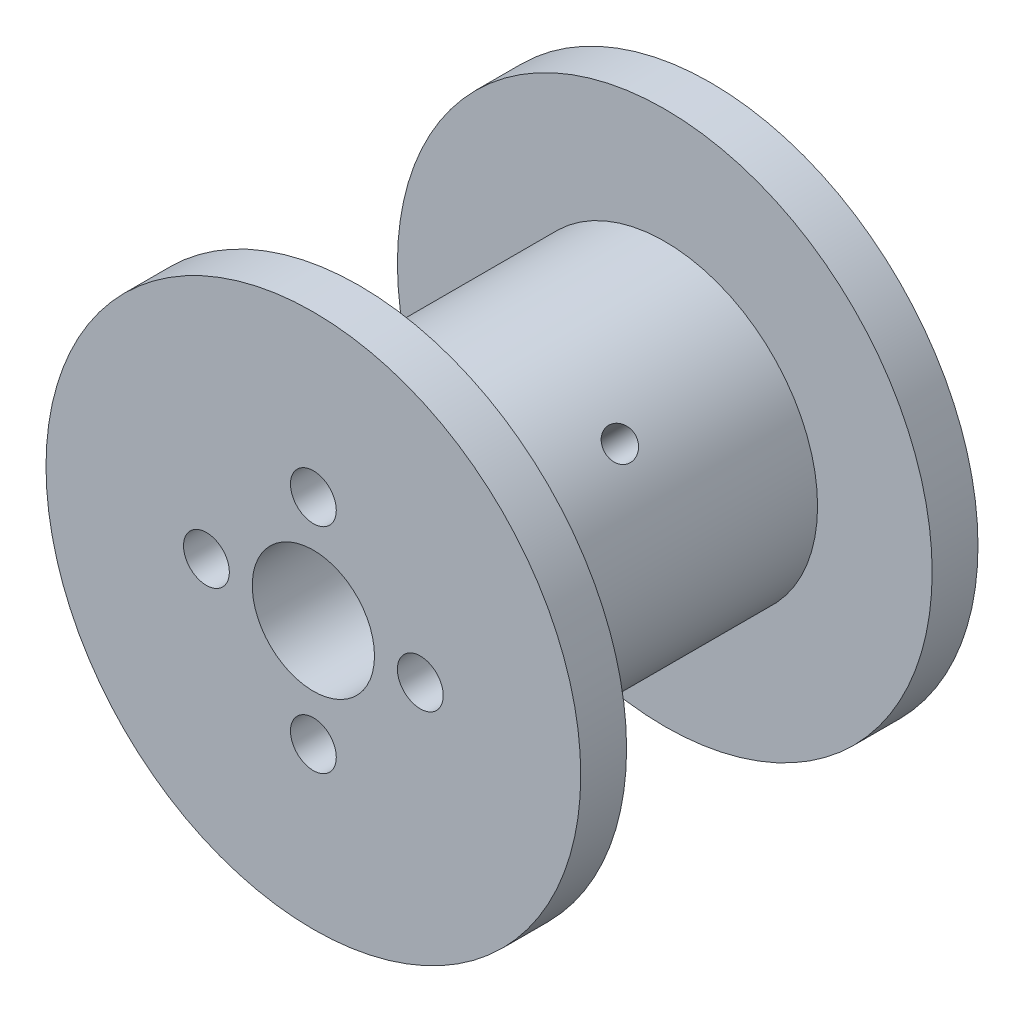
ISO-10303-21;
HEADER;
FILE_DESCRIPTION(('STEP AP214'),'2;1');
FILE_NAME('part.step','',(''),(''),'','','');
FILE_SCHEMA(('AUTOMOTIVE_DESIGN { 1 0 10303 214 1 1 1 1 }'));
ENDSEC;
DATA;
#1=APPLICATION_CONTEXT('core data for automotive mechanical design processes');
#2=APPLICATION_PROTOCOL_DEFINITION('international standard','automotive_design',2000,#1);
#3=PRODUCT_CONTEXT('',#1,'mechanical');
#4=PRODUCT('Part','Part','',(#3));
#5=PRODUCT_RELATED_PRODUCT_CATEGORY('part','',(#4));
#6=PRODUCT_DEFINITION_FORMATION('','',#4);
#7=PRODUCT_DEFINITION_CONTEXT('part definition',#1,'design');
#8=PRODUCT_DEFINITION('design','',#6,#7);
#9=PRODUCT_DEFINITION_SHAPE('','',#8);
#10=(LENGTH_UNIT() NAMED_UNIT(*) SI_UNIT(.MILLI.,.METRE.));
#11=(NAMED_UNIT(*) PLANE_ANGLE_UNIT() SI_UNIT($,.RADIAN.));
#12=(NAMED_UNIT(*) SI_UNIT($,.STERADIAN.) SOLID_ANGLE_UNIT());
#13=UNCERTAINTY_MEASURE_WITH_UNIT(LENGTH_MEASURE(1.E-05),#10,'distance_accuracy_value','');
#14=(GEOMETRIC_REPRESENTATION_CONTEXT(3) GLOBAL_UNCERTAINTY_ASSIGNED_CONTEXT((#13)) GLOBAL_UNIT_ASSIGNED_CONTEXT((#10,
#11,#12)) REPRESENTATION_CONTEXT('',''));
#15=CARTESIAN_POINT('',(0.,0.,0.));
#16=DIRECTION('',(0.,0.,1.));
#17=DIRECTION('',(1.,0.,0.));
#18=AXIS2_PLACEMENT_3D('',#15,#16,#17);
#19=CARTESIAN_POINT('',(0.,0.,23.));
#20=DIRECTION('',(0.,0.,-1.));
#21=DIRECTION('',(-1.,0.,0.));
#22=AXIS2_PLACEMENT_3D('',#19,#20,#21);
#23=CYLINDRICAL_SURFACE('',#22,4.);
#24=CARTESIAN_POINT('',(2.03150600633928,3.44571956871238,10.));
#25=CARTESIAN_POINT('',(2.03150786102785,3.44571920512029,9.94477969964321));
#26=CARTESIAN_POINT('',(2.03559547396367,3.44331850065809,9.88954204056864));
#27=CARTESIAN_POINT('',(2.05173976259927,3.43372233750071,9.78065296876739));
#28=CARTESIAN_POINT('',(2.06380107622934,3.42652408827732,9.72700249822003));
#29=CARTESIAN_POINT('',(2.09526941129613,3.40737177622151,9.62287858471216));
#30=CARTESIAN_POINT('',(2.11466694926496,3.39542385223409,9.57240113784224));
#31=CARTESIAN_POINT('',(2.15991728049346,3.3668190939273,9.47587565898752));
#32=CARTESIAN_POINT('',(2.18577034781144,3.35016205968684,9.42982781516885));
#33=CARTESIAN_POINT('',(2.24342318507772,3.31183801438652,9.34245534189415));
#34=CARTESIAN_POINT('',(2.27533077112197,3.29007815323238,9.30124255985972));
#35=CARTESIAN_POINT('',(2.3434782161646,3.24188966199224,9.22569544225612));
#36=CARTESIAN_POINT('',(2.37971847968101,3.21546059585828,9.19136174975137));
#37=CARTESIAN_POINT('',(2.45571367299132,3.15781142348737,9.13008981294742));
#38=CARTESIAN_POINT('',(2.49551058837384,3.12652961173735,9.10326144473539));
#39=CARTESIAN_POINT('',(2.576709820172,3.05995405259716,9.05847614233879));
#40=CARTESIAN_POINT('',(2.61811189874863,3.02466089808703,9.0405178992338));
#41=CARTESIAN_POINT('',(2.70021136375124,2.95157863702701,9.01434086616856));
#42=CARTESIAN_POINT('',(2.74090603476692,2.91385457814587,9.00593214226937));
#43=CARTESIAN_POINT('',(2.82110351284523,2.83628018487078,8.99849664828978));
#44=CARTESIAN_POINT('',(2.8606064952549,2.79643016570666,8.99946849111616));
#45=CARTESIAN_POINT('',(2.93640560200692,2.7167043471106,9.01062994010006));
#46=CARTESIAN_POINT('',(2.97275343471458,2.67684874087194,9.02061453002154));
#47=CARTESIAN_POINT('',(3.04232805283904,2.59750379746155,9.0491885080194));
#48=CARTESIAN_POINT('',(3.07555467200132,2.55801447990141,9.06777835415096));
#49=CARTESIAN_POINT('',(3.13853357116541,2.48034909905381,9.11320102827483));
#50=CARTESIAN_POINT('',(3.16825174624132,2.44218812554602,9.1401068178647));
#51=CARTESIAN_POINT('',(3.22344188944812,2.36886710892276,9.2013422716465));
#52=CARTESIAN_POINT('',(3.24891311746826,2.33370758938724,9.23567322742425));
#53=CARTESIAN_POINT('',(3.29598655689693,2.2667586461368,9.31188349679295));
#54=CARTESIAN_POINT('',(3.31746539702688,2.23508618721235,9.35394195693911));
#55=CARTESIAN_POINT('',(3.35553036421659,2.17752387619331,9.4438399894161));
#56=CARTESIAN_POINT('',(3.37211626260149,2.15163429437902,9.4916798317964));
#57=CARTESIAN_POINT('',(3.40038466911585,2.10667889035419,9.59211601365959));
#58=CARTESIAN_POINT('',(3.41204301122404,2.08764676459347,9.64473429212528));
#59=CARTESIAN_POINT('',(3.43028826074597,2.05753149124152,9.75303418723058));
#60=CARTESIAN_POINT('',(3.4368762534265,2.04644664263547,9.80871514559325));
#61=CARTESIAN_POINT('',(3.44484978028896,2.03299533053976,9.91998380060925));
#62=CARTESIAN_POINT('',(3.44636812686471,2.03040632843911,9.97553511733185));
#63=CARTESIAN_POINT('',(3.44456898147411,2.03345707765124,10.0863287746313));
#64=CARTESIAN_POINT('',(3.44125193466407,2.03909607147776,10.1415711431805));
#65=CARTESIAN_POINT('',(3.42989110163379,2.058146110096,10.2492457059819));
#66=CARTESIAN_POINT('',(3.421925540107,2.0714284826325,10.3017090906283));
#67=CARTESIAN_POINT('',(3.40136046898061,2.10502552062942,10.4033725831407));
#68=CARTESIAN_POINT('',(3.38876041044156,2.12534101912147,10.4525723036221));
#69=CARTESIAN_POINT('',(3.35868141978302,2.17256881347024,10.5473765111469));
#70=CARTESIAN_POINT('',(3.34111162675603,2.19960270192322,10.5928915360172));
#71=CARTESIAN_POINT('',(3.30128967041374,2.25892900785915,10.6780753451205));
#72=CARTESIAN_POINT('',(3.27903673751922,2.2912222894194,10.71774316666));
#73=CARTESIAN_POINT('',(3.22939367477673,2.36069500389995,10.7911244170284));
#74=CARTESIAN_POINT('',(3.20188893760893,2.3979764767813,10.8246640250195));
#75=CARTESIAN_POINT('',(3.14244727061751,2.47535893934294,10.8835743467805));
#76=CARTESIAN_POINT('',(3.11051057210333,2.51545978182308,10.9089454866433));
#77=CARTESIAN_POINT('',(3.04299066221868,2.59672397361252,10.9505784138112));
#78=CARTESIAN_POINT('',(3.0074359448092,2.63787736047576,10.9669057137516));
#79=CARTESIAN_POINT('',(2.93328464969675,2.72009229412941,10.9901841338434));
#80=CARTESIAN_POINT('',(2.89468866056234,2.76115385711612,10.9971370634956));
#81=CARTESIAN_POINT('',(2.81658886155832,2.84074861634765,11.0013675895755));
#82=CARTESIAN_POINT('',(2.7771378144922,2.87932015652093,10.9989017090954));
#83=CARTESIAN_POINT('',(2.69753562662628,2.95402799982967,10.9849521727057));
#84=CARTESIAN_POINT('',(2.65738450668216,2.99016437535494,10.9734687849869));
#85=CARTESIAN_POINT('',(2.57788737846442,3.05896187059983,10.9419477802291));
#86=CARTESIAN_POINT('',(2.53853819957819,3.09164065169263,10.9219565466854));
#87=CARTESIAN_POINT('',(2.4617186036955,3.15315173098225,10.8740294209807));
#88=CARTESIAN_POINT('',(2.42424842423321,3.1819835436249,10.8460925273304));
#89=CARTESIAN_POINT('',(2.35160421090075,3.23605610001212,10.7822847660029));
#90=CARTESIAN_POINT('',(2.31650669200102,3.26119426405297,10.7462398570926));
#91=CARTESIAN_POINT('',(2.25092698511471,3.30680007265379,10.6675771480262));
#92=CARTESIAN_POINT('',(2.22044596940983,3.32726653158134,10.6249576839021));
#93=CARTESIAN_POINT('',(2.16481641357636,3.36373296908821,10.5333985857987));
#94=CARTESIAN_POINT('',(2.13977796449598,3.37964249807525,10.4843558765875));
#95=CARTESIAN_POINT('',(2.09693411079246,3.40639248575232,10.3819445100772));
#96=CARTESIAN_POINT('',(2.07912344423753,3.41723663298652,10.3285790338927));
#97=CARTESIAN_POINT('',(2.05421347676282,3.43225503214215,10.2294229881737));
#98=CARTESIAN_POINT('',(2.04572600379187,3.437302490931,10.1841068356176));
#99=CARTESIAN_POINT('',(2.03437173124192,3.44403476813175,10.0925311309985));
#100=CARTESIAN_POINT('',(2.0315044522094,3.44571987338312,10.0462716597494));
#101=CARTESIAN_POINT('',(2.03150600633928,3.44571956871238,10.));
#102=B_SPLINE_CURVE_WITH_KNOTS('',3,(#24,#25,#26,#27,#28,#29,#30,#31,#32,#33,#34,#35,#36,#37,
#38,#39,#40,#41,#42,#43,#44,#45,#46,#47,#48,#49,#50,#51,#52,#53,#54,#55,#56,#57,#58,#59,#60,#61,
#62,#63,#64,#65,#66,#67,#68,#69,#70,#71,#72,#73,#74,#75,#76,#77,#78,#79,#80,#81,#82,#83,#84,#85,
#86,#87,#88,#89,#90,#91,#92,#93,#94,#95,#96,#97,#98,#99,#100,#101),.UNSPECIFIED.,.T.,.F.,(4,2,2,
2,2,2,2,2,2,2,2,2,2,2,2,2,2,2,2,2,2,2,2,2,2,2,2,2,2,2,2,2,2,2,2,2,2,2,4),(0.,0.16549097667523,
0.331078296534212,0.496452290829153,0.661833306984659,0.830495816734649,0.999174085882212,
1.17020598555443,1.34121263935111,1.50875500394413,1.67627259462683,1.84007305071853,
2.00388222686189,2.16917149698052,2.3344895418384,2.50428186625039,2.67408212476195,
2.84470572799635,3.01529280048094,3.18137429900961,3.34744050869795,3.51078961999957,
3.67415808564842,3.84073138339938,4.00733207550293,4.17810132382402,4.34886166284096,
4.51836829119047,4.6878421955989,4.85273378447257,5.01762046947067,5.18161950620159,
5.34563922291504,5.51358838629103,5.68158012622478,5.85270590910146,6.02370688542923,
6.16239130867207,6.30106390036083),.UNSPECIFIED.);
#103=CARTESIAN_POINT('',(2.03150600633928,3.44571956871238,10.));
#104=VERTEX_POINT('',#103);
#105=EDGE_CURVE('E85',#104,#104,#102,.T.);
#106=ORIENTED_EDGE('',*,*,#105,.F.);
#107=EDGE_LOOP('',(#106));
#108=FACE_BOUND('',#107,.T.);
#109=CARTESIAN_POINT('',(0.,0.,23.));
#110=DIRECTION('',(0.,0.,1.));
#111=DIRECTION('',(1.,0.,0.));
#112=AXIS2_PLACEMENT_3D('',#109,#110,#111);
#113=CIRCLE('',#112,4.);
#114=CARTESIAN_POINT('',(4.,0.,23.));
#115=VERTEX_POINT('',#114);
#116=EDGE_CURVE('E53',#115,#115,#113,.T.);
#117=ORIENTED_EDGE('',*,*,#116,.T.);
#118=EDGE_LOOP('',(#117));
#119=FACE_BOUND('',#118,.T.);
#120=CARTESIAN_POINT('',(0.,0.,-3.));
#121=DIRECTION('',(0.,0.,1.));
#122=DIRECTION('',(1.,0.,0.));
#123=AXIS2_PLACEMENT_3D('',#120,#121,#122);
#124=CIRCLE('',#123,4.);
#125=CARTESIAN_POINT('',(4.,0.,-3.));
#126=VERTEX_POINT('',#125);
#127=EDGE_CURVE('E88',#126,#126,#124,.T.);
#128=ORIENTED_EDGE('',*,*,#127,.F.);
#129=EDGE_LOOP('',(#128));
#130=FACE_BOUND('',#129,.T.);
#131=ADVANCED_FACE('F37',(#108,#119,#130),#23,.F.);
#132=CARTESIAN_POINT('',(-7.,0.,23.));
#133=DIRECTION('',(0.,0.,-1.));
#134=DIRECTION('',(-1.,0.,0.));
#135=AXIS2_PLACEMENT_3D('',#132,#133,#134);
#136=CYLINDRICAL_SURFACE('',#135,1.5);
#137=CARTESIAN_POINT('',(-7.,0.,23.));
#138=DIRECTION('',(0.,0.,1.));
#139=DIRECTION('',(1.,0.,0.));
#140=AXIS2_PLACEMENT_3D('',#137,#138,#139);
#141=CIRCLE('',#140,1.5);
#142=CARTESIAN_POINT('',(-5.5,0.,23.));
#143=VERTEX_POINT('',#142);
#144=EDGE_CURVE('E57',#143,#143,#141,.T.);
#145=ORIENTED_EDGE('',*,*,#144,.T.);
#146=EDGE_LOOP('',(#145));
#147=FACE_BOUND('',#146,.T.);
#148=CARTESIAN_POINT('',(-7.,0.,-3.));
#149=DIRECTION('',(0.,0.,1.));
#150=DIRECTION('',(1.,0.,0.));
#151=AXIS2_PLACEMENT_3D('',#148,#149,#150);
#152=CIRCLE('',#151,1.5);
#153=CARTESIAN_POINT('',(-5.5,0.,-3.));
#154=VERTEX_POINT('',#153);
#155=EDGE_CURVE('E91',#154,#154,#152,.T.);
#156=ORIENTED_EDGE('',*,*,#155,.F.);
#157=EDGE_LOOP('',(#156));
#158=FACE_BOUND('',#157,.T.);
#159=ADVANCED_FACE('F148',(#147,#158),#136,.F.);
#160=CARTESIAN_POINT('',(0.,-7.,23.));
#161=DIRECTION('',(0.,0.,-1.));
#162=DIRECTION('',(-1.,0.,0.));
#163=AXIS2_PLACEMENT_3D('',#160,#161,#162);
#164=CYLINDRICAL_SURFACE('',#163,1.5);
#165=CARTESIAN_POINT('',(0.,-7.,23.));
#166=DIRECTION('',(0.,0.,1.));
#167=DIRECTION('',(1.,0.,0.));
#168=AXIS2_PLACEMENT_3D('',#165,#166,#167);
#169=CIRCLE('',#168,1.5);
#170=CARTESIAN_POINT('',(1.49999999999995,-7.,23.));
#171=VERTEX_POINT('',#170);
#172=EDGE_CURVE('E62',#171,#171,#169,.T.);
#173=ORIENTED_EDGE('',*,*,#172,.T.);
#174=EDGE_LOOP('',(#173));
#175=FACE_BOUND('',#174,.T.);
#176=CARTESIAN_POINT('',(0.,-7.,-3.));
#177=DIRECTION('',(0.,0.,1.));
#178=DIRECTION('',(1.,0.,0.));
#179=AXIS2_PLACEMENT_3D('',#176,#177,#178);
#180=CIRCLE('',#179,1.5);
#181=CARTESIAN_POINT('',(1.49999999999995,-7.,-3.));
#182=VERTEX_POINT('',#181);
#183=EDGE_CURVE('E94',#182,#182,#180,.T.);
#184=ORIENTED_EDGE('',*,*,#183,.F.);
#185=EDGE_LOOP('',(#184));
#186=FACE_BOUND('',#185,.T.);
#187=ADVANCED_FACE('F153',(#175,#186),#164,.F.);
#188=CARTESIAN_POINT('',(7.,0.,23.));
#189=DIRECTION('',(0.,0.,-1.));
#190=DIRECTION('',(-1.,0.,0.));
#191=AXIS2_PLACEMENT_3D('',#188,#189,#190);
#192=CYLINDRICAL_SURFACE('',#191,1.5);
#193=CARTESIAN_POINT('',(7.,0.,23.));
#194=DIRECTION('',(0.,0.,1.));
#195=DIRECTION('',(1.,0.,0.));
#196=AXIS2_PLACEMENT_3D('',#193,#194,#195);
#197=CIRCLE('',#196,1.5);
#198=CARTESIAN_POINT('',(8.5,0.,23.));
#199=VERTEX_POINT('',#198);
#200=EDGE_CURVE('E65',#199,#199,#197,.T.);
#201=ORIENTED_EDGE('',*,*,#200,.T.);
#202=EDGE_LOOP('',(#201));
#203=FACE_BOUND('',#202,.T.);
#204=CARTESIAN_POINT('',(7.,0.,-3.));
#205=DIRECTION('',(0.,0.,1.));
#206=DIRECTION('',(1.,0.,0.));
#207=AXIS2_PLACEMENT_3D('',#204,#205,#206);
#208=CIRCLE('',#207,1.5);
#209=CARTESIAN_POINT('',(8.5,0.,-3.));
#210=VERTEX_POINT('',#209);
#211=EDGE_CURVE('E97',#210,#210,#208,.T.);
#212=ORIENTED_EDGE('',*,*,#211,.F.);
#213=EDGE_LOOP('',(#212));
#214=FACE_BOUND('',#213,.T.);
#215=ADVANCED_FACE('F144',(#203,#214),#192,.F.);
#216=CARTESIAN_POINT('',(0.,7.,23.));
#217=DIRECTION('',(0.,0.,-1.));
#218=DIRECTION('',(-1.,0.,0.));
#219=AXIS2_PLACEMENT_3D('',#216,#217,#218);
#220=CYLINDRICAL_SURFACE('',#219,1.5);
#221=CARTESIAN_POINT('',(0.,7.,23.));
#222=DIRECTION('',(0.,0.,1.));
#223=DIRECTION('',(1.,0.,0.));
#224=AXIS2_PLACEMENT_3D('',#221,#222,#223);
#225=CIRCLE('',#224,1.5);
#226=CARTESIAN_POINT('',(1.5,7.,23.));
#227=VERTEX_POINT('',#226);
#228=EDGE_CURVE('E68',#227,#227,#225,.T.);
#229=ORIENTED_EDGE('',*,*,#228,.T.);
#230=EDGE_LOOP('',(#229));
#231=FACE_BOUND('',#230,.T.);
#232=CARTESIAN_POINT('',(0.,7.,-3.));
#233=DIRECTION('',(0.,0.,1.));
#234=DIRECTION('',(1.,0.,0.));
#235=AXIS2_PLACEMENT_3D('',#232,#233,#234);
#236=CIRCLE('',#235,1.5);
#237=CARTESIAN_POINT('',(1.5,7.,-3.));
#238=VERTEX_POINT('',#237);
#239=EDGE_CURVE('E84',#238,#238,#236,.T.);
#240=ORIENTED_EDGE('',*,*,#239,.F.);
#241=EDGE_LOOP('',(#240));
#242=FACE_BOUND('',#241,.T.);
#243=ADVANCED_FACE('F39',(#231,#242),#220,.F.);
#244=CARTESIAN_POINT('',(0.,0.,23.));
#245=DIRECTION('',(0.,0.,-1.));
#246=DIRECTION('',(-1.,0.,0.));
#247=AXIS2_PLACEMENT_3D('',#244,#245,#246);
#248=CYLINDRICAL_SURFACE('',#247,17.5);
#249=CARTESIAN_POINT('',(0.,0.,20.));
#250=DIRECTION('',(0.,0.,1.));
#251=DIRECTION('',(1.,0.,0.));
#252=AXIS2_PLACEMENT_3D('',#249,#250,#251);
#253=CIRCLE('',#252,17.5);
#254=CARTESIAN_POINT('',(17.5,0.,20.));
#255=VERTEX_POINT('',#254);
#256=EDGE_CURVE('E71',#255,#255,#253,.T.);
#257=ORIENTED_EDGE('',*,*,#256,.T.);
#258=EDGE_LOOP('',(#257));
#259=FACE_BOUND('',#258,.T.);
#260=CARTESIAN_POINT('',(0.,0.,23.));
#261=DIRECTION('',(0.,0.,1.));
#262=DIRECTION('',(1.,0.,0.));
#263=AXIS2_PLACEMENT_3D('',#260,#261,#262);
#264=CIRCLE('',#263,17.5);
#265=CARTESIAN_POINT('',(17.5,0.,23.));
#266=VERTEX_POINT('',#265);
#267=EDGE_CURVE('E49',#266,#266,#264,.T.);
#268=ORIENTED_EDGE('',*,*,#267,.F.);
#269=EDGE_LOOP('',(#268));
#270=FACE_BOUND('',#269,.T.);
#271=ADVANCED_FACE('F137',(#259,#270),#248,.T.);
#272=CARTESIAN_POINT('',(0.,0.,23.));
#273=DIRECTION('',(0.,0.,1.));
#274=DIRECTION('',(1.,0.,0.));
#275=AXIS2_PLACEMENT_3D('',#272,#273,#274);
#276=PLANE('',#275);
#277=ORIENTED_EDGE('',*,*,#228,.F.);
#278=EDGE_LOOP('',(#277));
#279=FACE_BOUND('',#278,.T.);
#280=ORIENTED_EDGE('',*,*,#200,.F.);
#281=EDGE_LOOP('',(#280));
#282=FACE_BOUND('',#281,.T.);
#283=ORIENTED_EDGE('',*,*,#172,.F.);
#284=EDGE_LOOP('',(#283));
#285=FACE_BOUND('',#284,.T.);
#286=ORIENTED_EDGE('',*,*,#144,.F.);
#287=EDGE_LOOP('',(#286));
#288=FACE_BOUND('',#287,.T.);
#289=ORIENTED_EDGE('',*,*,#116,.F.);
#290=EDGE_LOOP('',(#289));
#291=FACE_BOUND('',#290,.T.);
#292=ORIENTED_EDGE('',*,*,#267,.T.);
#293=EDGE_LOOP('',(#292));
#294=FACE_BOUND('',#293,.T.);
#295=ADVANCED_FACE('F135',(#279,#282,#285,#288,#291,#294),#276,.T.);
#296=CARTESIAN_POINT('',(0.,0.,20.));
#297=DIRECTION('',(0.,0.,-1.));
#298=DIRECTION('',(-1.,0.,0.));
#299=AXIS2_PLACEMENT_3D('',#296,#297,#298);
#300=CYLINDRICAL_SURFACE('',#299,10.);
#301=CARTESIAN_POINT('',(6.32851685854858,7.7427304209217,10.));
#302=CARTESIAN_POINT('',(6.32851903891893,7.74272916955224,9.9439804358264));
#303=CARTESIAN_POINT('',(6.33219476125854,7.73972879354767,9.88792383158816));
#304=CARTESIAN_POINT('',(6.34677448981334,7.72777710603059,9.77736481370646));
#305=CARTESIAN_POINT('',(6.35768646189359,7.71881923631191,9.72286418196251));
#306=CARTESIAN_POINT('',(6.38633474794963,7.69513299552971,9.6170341807821));
#307=CARTESIAN_POINT('',(6.40406692464222,7.68040812275585,9.56570291060856));
#308=CARTESIAN_POINT('',(6.44571780448123,7.64548605725846,9.46763220770825));
#309=CARTESIAN_POINT('',(6.46963527889259,7.62528995138025,9.42089186551628));
#310=CARTESIAN_POINT('',(6.5229147496088,7.57976327925339,9.3331487363425));
#311=CARTESIAN_POINT('',(6.5522941007546,7.55441632184151,9.29216499049622));
#312=CARTESIAN_POINT('',(6.61545298811765,7.49916918480157,9.21726239099643));
#313=CARTESIAN_POINT('',(6.64923272554838,7.46926879695131,9.18334386059369));
#314=CARTESIAN_POINT('',(6.72015721158654,7.40552238491692,9.12346874299285));
#315=CARTESIAN_POINT('',(6.75730886810415,7.37166821818791,9.09752900120634));
#316=CARTESIAN_POINT('',(6.83372613698676,7.30088328082467,9.05445556685132));
#317=CARTESIAN_POINT('',(6.87299169779714,7.26395258520985,9.03732165963053));
#318=CARTESIAN_POINT('',(6.95228439647323,7.18809712968329,9.01240209064675));
#319=CARTESIAN_POINT('',(6.99230852715283,7.14917949768074,9.00458516725005));
#320=CARTESIAN_POINT('',(7.07205627408437,7.0703016017747,8.99842473086628));
#321=CARTESIAN_POINT('',(7.11177989810127,7.0303413649312,9.00008097225373));
#322=CARTESIAN_POINT('',(7.18966061965539,6.95067430448956,9.01279447265016));
#323=CARTESIAN_POINT('',(7.22782280796387,6.9109670856089,9.02381811556389));
#324=CARTESIAN_POINT('',(7.30171647825676,6.83284927414342,9.05490112894662));
#325=CARTESIAN_POINT('',(7.33744792865993,6.79443869840844,9.07496061678757));
#326=CARTESIAN_POINT('',(7.4056493079761,6.72003812791351,9.12358276325444));
#327=CARTESIAN_POINT('',(7.4381133970939,6.68405250393304,9.15216029753016));
#328=CARTESIAN_POINT('',(7.49895039938136,6.61572663489392,9.21699652333637));
#329=CARTESIAN_POINT('',(7.52732319252113,6.58338649679211,9.25325544014518));
#330=CARTESIAN_POINT('',(7.57946748050867,6.52328644577235,9.33261422951364));
#331=CARTESIAN_POINT('',(7.60321829602415,6.495547195945,9.37574334474158));
#332=CARTESIAN_POINT('',(7.64546121060861,6.44577318904218,9.46751686521078));
#333=CARTESIAN_POINT('',(7.66395330204953,6.4237384402414,9.51616127845214));
#334=CARTESIAN_POINT('',(7.69530385598411,6.38614912970665,9.61760702519979));
#335=CARTESIAN_POINT('',(7.70816113063312,6.37059593434713,9.67040923242289));
#336=CARTESIAN_POINT('',(7.72797690895265,6.34654377660673,9.77866060461469));
#337=CARTESIAN_POINT('',(7.73493559233371,6.33804459931348,9.83410968888744));
#338=CARTESIAN_POINT('',(7.74279845138221,6.32843671422882,9.94582417952951));
#339=CARTESIAN_POINT('',(7.7437286725964,6.32729621388552,10.0020850202648));
#340=CARTESIAN_POINT('',(7.73958548527302,6.3323634456235,10.1140512658229));
#341=CARTESIAN_POINT('',(7.73451215785657,6.33857107841537,10.1697566781404));
#342=CARTESIAN_POINT('',(7.71847966187994,6.35808374983208,10.2789115822783));
#343=CARTESIAN_POINT('',(7.70753289122163,6.37137383812434,10.3323655710947));
#344=CARTESIAN_POINT('',(7.6799784127643,6.4045604084813,10.4356400517303));
#345=CARTESIAN_POINT('',(7.663370575293,6.42445704187512,10.4854604602872));
#346=CARTESIAN_POINT('',(7.62476130329712,6.47023270430207,10.5802399740288));
#347=CARTESIAN_POINT('',(7.60274168913029,6.49613188045666,10.6251819419663));
#348=CARTESIAN_POINT('',(7.55379466293418,6.55298325470013,10.7087550532741));
#349=CARTESIAN_POINT('',(7.52686712938519,6.58393557790256,10.7473860403401));
#350=CARTESIAN_POINT('',(7.46858223095798,6.64997912937953,10.8173816333981));
#351=CARTESIAN_POINT('',(7.43720925634101,6.68508486704156,10.8487195595862));
#352=CARTESIAN_POINT('',(7.37083310175001,6.75819901458966,10.9030558685064));
#353=CARTESIAN_POINT('',(7.3358299715256,6.79620738469462,10.9260543655071));
#354=CARTESIAN_POINT('',(7.26312383352962,6.87385288640207,10.9630137676553));
#355=CARTESIAN_POINT('',(7.22542577413825,6.91348697858631,10.9769907873252));
#356=CARTESIAN_POINT('',(7.14826814640119,6.99323524769287,10.9955630695798));
#357=CARTESIAN_POINT('',(7.10880862759366,7.0333494110908,11.000158595834));
#358=CARTESIAN_POINT('',(7.02940589989498,7.11270622403686,10.9998337335601));
#359=CARTESIAN_POINT('',(6.989465551409,7.15195191171762,10.9949547631633));
#360=CARTESIAN_POINT('',(6.91009710797937,7.22866552557874,10.975906254343));
#361=CARTESIAN_POINT('',(6.87066901343783,7.26613345036367,10.961736708627));
#362=CARTESIAN_POINT('',(6.79352651183048,7.33830973130598,10.9245207426071));
#363=CARTESIAN_POINT('',(6.75581187181005,7.37301846307651,10.9014755330658));
#364=CARTESIAN_POINT('',(6.68327173170939,7.43883597514417,10.847166831083));
#365=CARTESIAN_POINT('',(6.64844621472557,7.46994477650407,10.8159033867289));
#366=CARTESIAN_POINT('',(6.58266853744656,7.52797516186516,10.7458903809762));
#367=CARTESIAN_POINT('',(6.55173322821183,7.55487864428192,10.7071099837552));
#368=CARTESIAN_POINT('',(6.49493711041091,7.60376222742857,10.6232246484546));
#369=CARTESIAN_POINT('',(6.46907752141633,7.62574114508492,10.5781181948309));
#370=CARTESIAN_POINT('',(6.42327823418613,7.66435902109567,10.4827356580801));
#371=CARTESIAN_POINT('',(6.40335375942969,7.68098425602722,10.4324467186759));
#372=CARTESIAN_POINT('',(6.37024525801367,7.70846564180199,10.3282517087538));
#373=CARTESIAN_POINT('',(6.3570536288436,7.7193283001082,10.2743497960743));
#374=CARTESIAN_POINT('',(6.34117690965973,7.73236946290159,10.1834522591009));
#375=CARTESIAN_POINT('',(6.33643732840585,7.73625096155656,10.1470377486936));
#376=CARTESIAN_POINT('',(6.33010659164487,7.74143184711834,10.0737541769574));
#377=CARTESIAN_POINT('',(6.32851542292127,7.74273124486438,10.0368851175374));
#378=CARTESIAN_POINT('',(6.32851685854858,7.7427304209217,10.));
#379=B_SPLINE_CURVE_WITH_KNOTS('',3,(#301,#302,#303,#304,#305,#306,#307,#308,#309,#310,#311,
#312,#313,#314,#315,#316,#317,#318,#319,#320,#321,#322,#323,#324,#325,#326,#327,#328,#329,#330,
#331,#332,#333,#334,#335,#336,#337,#338,#339,#340,#341,#342,#343,#344,#345,#346,#347,#348,#349,
#350,#351,#352,#353,#354,#355,#356,#357,#358,#359,#360,#361,#362,#363,#364,#365,#366,#367,#368,
#369,#370,#371,#372,#373,#374,#375,#376,#377,#378),.UNSPECIFIED.,.T.,.F.,(4,2,2,2,2,2,2,2,2,2,2,
2,2,2,2,2,2,2,2,2,2,2,2,2,2,2,2,2,2,2,2,2,2,2,2,2,2,2,4),(0.,0.167923994436462,
0.336033151821769,0.504040490997474,0.672014480421312,0.840531615299249,1.00905645855253,
1.17793469971292,1.34680882407795,1.5151147089845,1.68341622998232,1.85111631818662,
2.01881858480974,2.18681545466413,2.35481725218529,2.52355425085001,2.69229149427563,
2.86106429117933,3.02983194595033,3.19786996307765,3.3659057096687,3.53358814704527,
3.70127442561047,3.86953189811718,4.03779353723203,4.20666136818118,4.37552688518005,
4.54408992694361,4.71264823113149,4.88047133468483,5.04829456996658,5.21609491995246,
5.38389428810799,5.55239715037988,5.72094045034525,5.88991241070477,6.05869314894001,
6.16926027606047,6.27982693903815),.UNSPECIFIED.);
#380=CARTESIAN_POINT('',(6.32851685854858,7.7427304209217,10.));
#381=VERTEX_POINT('',#380);
#382=EDGE_CURVE('E10',#381,#381,#379,.T.);
#383=ORIENTED_EDGE('',*,*,#382,.T.);
#384=EDGE_LOOP('',(#383));
#385=FACE_BOUND('',#384,.T.);
#386=CARTESIAN_POINT('',(0.,0.,20.));
#387=DIRECTION('',(0.,0.,1.));
#388=DIRECTION('',(1.,0.,0.));
#389=AXIS2_PLACEMENT_3D('',#386,#387,#388);
#390=CIRCLE('',#389,10.);
#391=CARTESIAN_POINT('',(10.,0.,20.));
#392=VERTEX_POINT('',#391);
#393=EDGE_CURVE('E75',#392,#392,#390,.T.);
#394=ORIENTED_EDGE('',*,*,#393,.F.);
#395=EDGE_LOOP('',(#394));
#396=FACE_BOUND('',#395,.T.);
#397=CARTESIAN_POINT('',(0.,0.,0.));
#398=DIRECTION('',(0.,0.,1.));
#399=DIRECTION('',(1.,0.,0.));
#400=AXIS2_PLACEMENT_3D('',#397,#398,#399);
#401=CIRCLE('',#400,10.);
#402=CARTESIAN_POINT('',(10.,0.,0.));
#403=VERTEX_POINT('',#402);
#404=EDGE_CURVE('E72',#403,#403,#401,.T.);
#405=ORIENTED_EDGE('',*,*,#404,.T.);
#406=EDGE_LOOP('',(#405));
#407=FACE_BOUND('',#406,.T.);
#408=ADVANCED_FACE('F130',(#385,#396,#407),#300,.T.);
#409=CARTESIAN_POINT('',(0.,0.,20.));
#410=DIRECTION('',(0.,0.,1.));
#411=DIRECTION('',(1.,0.,0.));
#412=AXIS2_PLACEMENT_3D('',#409,#410,#411);
#413=PLANE('',#412);
#414=ORIENTED_EDGE('',*,*,#393,.T.);
#415=EDGE_LOOP('',(#414));
#416=FACE_BOUND('',#415,.T.);
#417=ORIENTED_EDGE('',*,*,#256,.F.);
#418=EDGE_LOOP('',(#417));
#419=FACE_BOUND('',#418,.T.);
#420=ADVANCED_FACE('F127',(#416,#419),#413,.F.);
#421=CARTESIAN_POINT('',(0.,0.,-3.));
#422=DIRECTION('',(0.,0.,1.));
#423=DIRECTION('',(1.,0.,0.));
#424=AXIS2_PLACEMENT_3D('',#421,#422,#423);
#425=CYLINDRICAL_SURFACE('',#424,17.5);
#426=CARTESIAN_POINT('',(0.,0.,-3.));
#427=DIRECTION('',(0.,0.,1.));
#428=DIRECTION('',(1.,0.,0.));
#429=AXIS2_PLACEMENT_3D('',#426,#427,#428);
#430=CIRCLE('',#429,17.5);
#431=CARTESIAN_POINT('',(17.5,0.,-3.));
#432=VERTEX_POINT('',#431);
#433=EDGE_CURVE('E76',#432,#432,#430,.T.);
#434=ORIENTED_EDGE('',*,*,#433,.T.);
#435=EDGE_LOOP('',(#434));
#436=FACE_BOUND('',#435,.T.);
#437=CARTESIAN_POINT('',(0.,0.,0.));
#438=DIRECTION('',(0.,0.,1.));
#439=DIRECTION('',(1.,0.,0.));
#440=AXIS2_PLACEMENT_3D('',#437,#438,#439);
#441=CIRCLE('',#440,17.5);
#442=CARTESIAN_POINT('',(17.5,0.,0.));
#443=VERTEX_POINT('',#442);
#444=EDGE_CURVE('E81',#443,#443,#441,.T.);
#445=ORIENTED_EDGE('',*,*,#444,.F.);
#446=EDGE_LOOP('',(#445));
#447=FACE_BOUND('',#446,.T.);
#448=ADVANCED_FACE('F120',(#436,#447),#425,.T.);
#449=CARTESIAN_POINT('',(0.,0.,-3.));
#450=DIRECTION('',(0.,0.,1.));
#451=DIRECTION('',(1.,0.,0.));
#452=AXIS2_PLACEMENT_3D('',#449,#450,#451);
#453=PLANE('',#452);
#454=ORIENTED_EDGE('',*,*,#239,.T.);
#455=EDGE_LOOP('',(#454));
#456=FACE_BOUND('',#455,.T.);
#457=ORIENTED_EDGE('',*,*,#211,.T.);
#458=EDGE_LOOP('',(#457));
#459=FACE_BOUND('',#458,.T.);
#460=ORIENTED_EDGE('',*,*,#183,.T.);
#461=EDGE_LOOP('',(#460));
#462=FACE_BOUND('',#461,.T.);
#463=ORIENTED_EDGE('',*,*,#155,.T.);
#464=EDGE_LOOP('',(#463));
#465=FACE_BOUND('',#464,.T.);
#466=ORIENTED_EDGE('',*,*,#127,.T.);
#467=EDGE_LOOP('',(#466));
#468=FACE_BOUND('',#467,.T.);
#469=ORIENTED_EDGE('',*,*,#433,.F.);
#470=EDGE_LOOP('',(#469));
#471=FACE_BOUND('',#470,.T.);
#472=ADVANCED_FACE('F116',(#456,#459,#462,#465,#468,#471),#453,.F.);
#473=CARTESIAN_POINT('',(0.,0.,0.));
#474=DIRECTION('',(0.,0.,1.));
#475=DIRECTION('',(1.,0.,0.));
#476=AXIS2_PLACEMENT_3D('',#473,#474,#475);
#477=PLANE('',#476);
#478=ORIENTED_EDGE('',*,*,#404,.F.);
#479=EDGE_LOOP('',(#478));
#480=FACE_BOUND('',#479,.T.);
#481=ORIENTED_EDGE('',*,*,#444,.T.);
#482=EDGE_LOOP('',(#481));
#483=FACE_BOUND('',#482,.T.);
#484=ADVANCED_FACE('F114',(#480,#483),#477,.T.);
#485=CARTESIAN_POINT('',(0.707106781186547,0.707106781186549,10.));
#486=DIRECTION('',(0.707106781186546,0.707106781186549,0.));
#487=DIRECTION('',(-0.707106781186549,0.707106781186546,0.));
#488=AXIS2_PLACEMENT_3D('',#485,#486,#487);
#489=CYLINDRICAL_SURFACE('',#488,1.);
#490=ORIENTED_EDGE('',*,*,#105,.T.);
#491=EDGE_LOOP('',(#490));
#492=FACE_BOUND('',#491,.T.);
#493=ORIENTED_EDGE('',*,*,#382,.F.);
#494=EDGE_LOOP('',(#493));
#495=FACE_BOUND('',#494,.T.);
#496=ADVANCED_FACE('F110',(#492,#495),#489,.F.);
#497=CLOSED_SHELL('',(#131,#159,#187,#215,#243,#271,#295,#408,#420,#448,#472,#484,#496));
#498=MANIFOLD_SOLID_BREP('B2',#497);
#499=ADVANCED_BREP_SHAPE_REPRESENTATION('',(#18,#498),#14);
#500=SHAPE_DEFINITION_REPRESENTATION(#9,#499);
ENDSEC;
END-ISO-10303-21;
